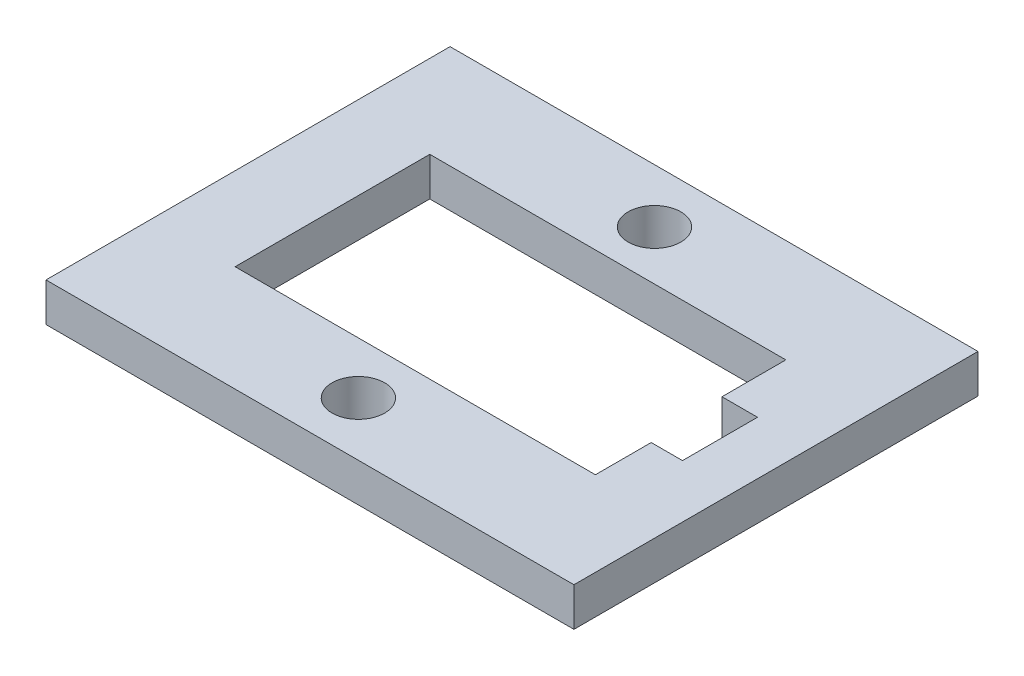
ISO-10303-21;
HEADER;
FILE_DESCRIPTION(('STEP AP214'),'2;1');
FILE_NAME('part.step','',(''),(''),'','','');
FILE_SCHEMA(('AUTOMOTIVE_DESIGN { 1 0 10303 214 1 1 1 1 }'));
ENDSEC;
DATA;
#1=APPLICATION_CONTEXT('core data for automotive mechanical design processes');
#2=APPLICATION_PROTOCOL_DEFINITION('international standard','automotive_design',2000,#1);
#3=PRODUCT_CONTEXT('',#1,'mechanical');
#4=PRODUCT('Part','Part','',(#3));
#5=PRODUCT_RELATED_PRODUCT_CATEGORY('part','',(#4));
#6=PRODUCT_DEFINITION_FORMATION('','',#4);
#7=PRODUCT_DEFINITION_CONTEXT('part definition',#1,'design');
#8=PRODUCT_DEFINITION('design','',#6,#7);
#9=PRODUCT_DEFINITION_SHAPE('','',#8);
#10=(LENGTH_UNIT() NAMED_UNIT(*) SI_UNIT(.MILLI.,.METRE.));
#11=(NAMED_UNIT(*) PLANE_ANGLE_UNIT() SI_UNIT($,.RADIAN.));
#12=(NAMED_UNIT(*) SI_UNIT($,.STERADIAN.) SOLID_ANGLE_UNIT());
#13=UNCERTAINTY_MEASURE_WITH_UNIT(LENGTH_MEASURE(1.E-05),#10,'distance_accuracy_value','');
#14=(GEOMETRIC_REPRESENTATION_CONTEXT(3) GLOBAL_UNCERTAINTY_ASSIGNED_CONTEXT((#13)) GLOBAL_UNIT_ASSIGNED_CONTEXT((#10,
#11,#12)) REPRESENTATION_CONTEXT('',''));
#15=CARTESIAN_POINT('',(0.,0.,0.));
#16=DIRECTION('',(0.,0.,1.));
#17=DIRECTION('',(1.,0.,0.));
#18=AXIS2_PLACEMENT_3D('',#15,#16,#17);
#19=CARTESIAN_POINT('',(0.,1.25,0.));
#20=DIRECTION('',(0.,1.,0.));
#21=DIRECTION('',(0.,0.,1.));
#22=AXIS2_PLACEMENT_3D('',#19,#20,#21);
#23=PLANE('',#22);
#24=CARTESIAN_POINT('',(0.,1.25,-10.5288589852008));
#25=DIRECTION('',(0.,1.,0.));
#26=DIRECTION('',(0.,0.,1.));
#27=AXIS2_PLACEMENT_3D('',#24,#25,#26);
#28=CIRCLE('',#27,1.7);
#29=CARTESIAN_POINT('',(0.,1.25,-8.82885898520084));
#30=VERTEX_POINT('',#29);
#31=EDGE_CURVE('E163',#30,#30,#28,.T.);
#32=ORIENTED_EDGE('',*,*,#31,.F.);
#33=EDGE_LOOP('',(#32));
#34=FACE_BOUND('',#33,.T.);
#35=DIRECTION('',(0.,0.,1.));
#36=VECTOR('',#35,1.);
#37=CARTESIAN_POINT('',(-16.7014916384778,1.25,-14.0165789852008));
#38=LINE('',#37,#36);
#39=CARTESIAN_POINT('',(-16.7014916384778,1.25,-14.0165789852008));
#40=VERTEX_POINT('',#39);
#41=CARTESIAN_POINT('',(-16.7014916384778,1.25,12.1011510147992));
#42=VERTEX_POINT('',#41);
#43=EDGE_CURVE('E193',#40,#42,#38,.T.);
#44=ORIENTED_EDGE('',*,*,#43,.T.);
#45=DIRECTION('',(1.,0.,0.));
#46=VECTOR('',#45,1.);
#47=CARTESIAN_POINT('',(-16.7014916384778,1.25,12.1011510147992));
#48=LINE('',#47,#46);
#49=CARTESIAN_POINT('',(17.4229383615222,1.25,12.1011510147992));
#50=VERTEX_POINT('',#49);
#51=EDGE_CURVE('E196',#42,#50,#48,.T.);
#52=ORIENTED_EDGE('',*,*,#51,.T.);
#53=DIRECTION('',(0.,0.,-1.));
#54=VECTOR('',#53,1.);
#55=CARTESIAN_POINT('',(17.4229383615222,1.25,-14.0165789852008));
#56=LINE('',#55,#54);
#57=CARTESIAN_POINT('',(17.4229383615222,1.25,-14.0165789852008));
#58=VERTEX_POINT('',#57);
#59=EDGE_CURVE('E199',#50,#58,#56,.T.);
#60=ORIENTED_EDGE('',*,*,#59,.T.);
#61=DIRECTION('',(-1.,0.,0.));
#62=VECTOR('',#61,1.);
#63=CARTESIAN_POINT('',(-16.7014916384778,1.25,-14.0165789852008));
#64=LINE('',#63,#62);
#65=EDGE_CURVE('E201',#58,#40,#64,.T.);
#66=ORIENTED_EDGE('',*,*,#65,.T.);
#67=EDGE_LOOP('',(#44,#52,#60,#66));
#68=FACE_BOUND('',#67,.T.);
#69=DIRECTION('',(1.,0.,0.));
#70=VECTOR('',#69,1.);
#71=CARTESIAN_POINT('',(11.9605883615222,1.25,5.25114101479916));
#72=LINE('',#71,#70);
#73=CARTESIAN_POINT('',(-11.3290016384778,1.25,5.25114101479916));
#74=VERTEX_POINT('',#73);
#75=CARTESIAN_POINT('',(11.9605883615222,1.25,5.25114101479916));
#76=VERTEX_POINT('',#75);
#77=EDGE_CURVE('E133',#74,#76,#72,.T.);
#78=ORIENTED_EDGE('',*,*,#77,.F.);
#79=DIRECTION('',(0.,0.,1.));
#80=VECTOR('',#79,1.);
#81=CARTESIAN_POINT('',(-11.3290016384778,1.25,5.25114101479916));
#82=LINE('',#81,#80);
#83=CARTESIAN_POINT('',(-11.3290016384778,1.25,-7.33354898520084));
#84=VERTEX_POINT('',#83);
#85=EDGE_CURVE('E125',#84,#74,#82,.T.);
#86=ORIENTED_EDGE('',*,*,#85,.F.);
#87=DIRECTION('',(-1.,0.,0.));
#88=VECTOR('',#87,1.);
#89=CARTESIAN_POINT('',(-11.3290016384778,1.25,-7.33354898520084));
#90=LINE('',#89,#88);
#91=CARTESIAN_POINT('',(11.6851488266385,1.25,-7.33354898520084));
#92=VERTEX_POINT('',#91);
#93=EDGE_CURVE('E160',#92,#84,#90,.T.);
#94=ORIENTED_EDGE('',*,*,#93,.F.);
#95=DIRECTION('',(0.,0.,-1.));
#96=VECTOR('',#95,1.);
#97=CARTESIAN_POINT('',(11.6851488266385,1.25,-7.33354898520084));
#98=LINE('',#97,#96);
#99=CARTESIAN_POINT('',(11.6851488266385,1.25,-3.20588260042284));
#100=VERTEX_POINT('',#99);
#101=EDGE_CURVE('E158',#100,#92,#98,.T.);
#102=ORIENTED_EDGE('',*,*,#101,.F.);
#103=DIRECTION('',(-1.,0.,0.));
#104=VECTOR('',#103,1.);
#105=CARTESIAN_POINT('',(11.6851488266385,1.25,-3.20588260042284));
#106=LINE('',#105,#104);
#107=CARTESIAN_POINT('',(13.9825383615222,1.25,-3.20588260042284));
#108=VERTEX_POINT('',#107);
#109=EDGE_CURVE('E156',#108,#100,#106,.T.);
#110=ORIENTED_EDGE('',*,*,#109,.F.);
#111=DIRECTION('',(0.,0.,-1.));
#112=VECTOR('',#111,1.);
#113=CARTESIAN_POINT('',(13.9825383615222,1.25,-3.20588260042284));
#114=LINE('',#113,#112);
#115=CARTESIAN_POINT('',(13.9825383615222,1.25,1.64390739957716));
#116=VERTEX_POINT('',#115);
#117=EDGE_CURVE('E154',#116,#108,#114,.T.);
#118=ORIENTED_EDGE('',*,*,#117,.F.);
#119=DIRECTION('',(1.,0.,0.));
#120=VECTOR('',#119,1.);
#121=CARTESIAN_POINT('',(13.9825383615222,1.25,1.64390739957716));
#122=LINE('',#121,#120);
#123=CARTESIAN_POINT('',(11.9605883615222,1.25,1.64390739957716));
#124=VERTEX_POINT('',#123);
#125=EDGE_CURVE('E149',#124,#116,#122,.T.);
#126=ORIENTED_EDGE('',*,*,#125,.F.);
#127=DIRECTION('',(0.,0.,-1.));
#128=VECTOR('',#127,1.);
#129=CARTESIAN_POINT('',(11.9605883615222,1.25,1.64390739957716));
#130=LINE('',#129,#128);
#131=EDGE_CURVE('E147',#76,#124,#130,.T.);
#132=ORIENTED_EDGE('',*,*,#131,.F.);
#133=EDGE_LOOP('',(#78,#86,#94,#102,#110,#118,#126,#132));
#134=FACE_BOUND('',#133,.T.);
#135=CARTESIAN_POINT('',(0.,1.25,8.61115101479916));
#136=DIRECTION('',(0.,1.,0.));
#137=DIRECTION('',(0.,0.,1.));
#138=AXIS2_PLACEMENT_3D('',#135,#136,#137);
#139=CIRCLE('',#138,1.7);
#140=CARTESIAN_POINT('',(0.,1.25,10.3111510147992));
#141=VERTEX_POINT('',#140);
#142=EDGE_CURVE('E299',#141,#141,#139,.T.);
#143=ORIENTED_EDGE('',*,*,#142,.F.);
#144=EDGE_LOOP('',(#143));
#145=FACE_BOUND('',#144,.T.);
#146=ADVANCED_FACE('F36',(#34,#68,#134,#145),#23,.T.);
#147=CARTESIAN_POINT('',(0.,-1.25,0.));
#148=DIRECTION('',(0.,1.,0.));
#149=DIRECTION('',(0.,0.,1.));
#150=AXIS2_PLACEMENT_3D('',#147,#148,#149);
#151=PLANE('',#150);
#152=DIRECTION('',(0.,0.,1.));
#153=VECTOR('',#152,1.);
#154=CARTESIAN_POINT('',(-16.7014916384778,-1.25,-14.0165789852008));
#155=LINE('',#154,#153);
#156=CARTESIAN_POINT('',(-16.7014916384778,-1.25,-14.0165789852008));
#157=VERTEX_POINT('',#156);
#158=CARTESIAN_POINT('',(-16.7014916384778,-1.25,12.1011510147992));
#159=VERTEX_POINT('',#158);
#160=EDGE_CURVE('E141',#157,#159,#155,.T.);
#161=ORIENTED_EDGE('',*,*,#160,.F.);
#162=DIRECTION('',(-1.,0.,0.));
#163=VECTOR('',#162,1.);
#164=CARTESIAN_POINT('',(-16.7014916384778,-1.25,-14.0165789852008));
#165=LINE('',#164,#163);
#166=CARTESIAN_POINT('',(17.4229383615222,-1.25,-14.0165789852008));
#167=VERTEX_POINT('',#166);
#168=EDGE_CURVE('E197',#167,#157,#165,.T.);
#169=ORIENTED_EDGE('',*,*,#168,.F.);
#170=DIRECTION('',(0.,0.,-1.));
#171=VECTOR('',#170,1.);
#172=CARTESIAN_POINT('',(17.4229383615222,-1.25,-14.0165789852008));
#173=LINE('',#172,#171);
#174=CARTESIAN_POINT('',(17.4229383615222,-1.25,12.1011510147992));
#175=VERTEX_POINT('',#174);
#176=EDGE_CURVE('E208',#175,#167,#173,.T.);
#177=ORIENTED_EDGE('',*,*,#176,.F.);
#178=DIRECTION('',(1.,0.,0.));
#179=VECTOR('',#178,1.);
#180=CARTESIAN_POINT('',(-16.7014916384778,-1.25,12.1011510147992));
#181=LINE('',#180,#179);
#182=EDGE_CURVE('E206',#159,#175,#181,.T.);
#183=ORIENTED_EDGE('',*,*,#182,.F.);
#184=EDGE_LOOP('',(#161,#169,#177,#183));
#185=FACE_BOUND('',#184,.T.);
#186=DIRECTION('',(0.,0.,1.));
#187=VECTOR('',#186,1.);
#188=CARTESIAN_POINT('',(-11.3290016384778,-1.25,5.25114101479916));
#189=LINE('',#188,#187);
#190=CARTESIAN_POINT('',(-11.3290016384778,-1.25,-7.33354898520084));
#191=VERTEX_POINT('',#190);
#192=CARTESIAN_POINT('',(-11.3290016384778,-1.25,5.25114101479916));
#193=VERTEX_POINT('',#192);
#194=EDGE_CURVE('E59',#191,#193,#189,.T.);
#195=ORIENTED_EDGE('',*,*,#194,.T.);
#196=DIRECTION('',(1.,0.,0.));
#197=VECTOR('',#196,1.);
#198=CARTESIAN_POINT('',(11.9605883615222,-1.25,5.25114101479916));
#199=LINE('',#198,#197);
#200=CARTESIAN_POINT('',(11.9605883615222,-1.25,5.25114101479916));
#201=VERTEX_POINT('',#200);
#202=EDGE_CURVE('E140',#193,#201,#199,.T.);
#203=ORIENTED_EDGE('',*,*,#202,.T.);
#204=DIRECTION('',(0.,0.,-1.));
#205=VECTOR('',#204,1.);
#206=CARTESIAN_POINT('',(11.9605883615222,-1.25,1.64390739957716));
#207=LINE('',#206,#205);
#208=CARTESIAN_POINT('',(11.9605883615222,-1.25,1.64390739957716));
#209=VERTEX_POINT('',#208);
#210=EDGE_CURVE('E165',#201,#209,#207,.T.);
#211=ORIENTED_EDGE('',*,*,#210,.T.);
#212=DIRECTION('',(1.,0.,0.));
#213=VECTOR('',#212,1.);
#214=CARTESIAN_POINT('',(13.9825383615222,-1.25,1.64390739957716));
#215=LINE('',#214,#213);
#216=CARTESIAN_POINT('',(13.9825383615222,-1.25,1.64390739957716));
#217=VERTEX_POINT('',#216);
#218=EDGE_CURVE('E168',#209,#217,#215,.T.);
#219=ORIENTED_EDGE('',*,*,#218,.T.);
#220=DIRECTION('',(0.,0.,-1.));
#221=VECTOR('',#220,1.);
#222=CARTESIAN_POINT('',(13.9825383615222,-1.25,-3.20588260042284));
#223=LINE('',#222,#221);
#224=CARTESIAN_POINT('',(13.9825383615222,-1.25,-3.20588260042284));
#225=VERTEX_POINT('',#224);
#226=EDGE_CURVE('E171',#217,#225,#223,.T.);
#227=ORIENTED_EDGE('',*,*,#226,.T.);
#228=DIRECTION('',(-1.,0.,0.));
#229=VECTOR('',#228,1.);
#230=CARTESIAN_POINT('',(11.6851488266385,-1.25,-3.20588260042284));
#231=LINE('',#230,#229);
#232=CARTESIAN_POINT('',(11.6851488266385,-1.25,-3.20588260042284));
#233=VERTEX_POINT('',#232);
#234=EDGE_CURVE('E174',#225,#233,#231,.T.);
#235=ORIENTED_EDGE('',*,*,#234,.T.);
#236=DIRECTION('',(0.,0.,-1.));
#237=VECTOR('',#236,1.);
#238=CARTESIAN_POINT('',(11.6851488266385,-1.25,-7.33354898520084));
#239=LINE('',#238,#237);
#240=CARTESIAN_POINT('',(11.6851488266385,-1.25,-7.33354898520084));
#241=VERTEX_POINT('',#240);
#242=EDGE_CURVE('E177',#233,#241,#239,.T.);
#243=ORIENTED_EDGE('',*,*,#242,.T.);
#244=DIRECTION('',(-1.,0.,0.));
#245=VECTOR('',#244,1.);
#246=CARTESIAN_POINT('',(-11.3290016384778,-1.25,-7.33354898520084));
#247=LINE('',#246,#245);
#248=EDGE_CURVE('E134',#241,#191,#247,.T.);
#249=ORIENTED_EDGE('',*,*,#248,.T.);
#250=EDGE_LOOP('',(#195,#203,#211,#219,#227,#235,#243,#249));
#251=FACE_BOUND('',#250,.T.);
#252=CARTESIAN_POINT('',(0.,-1.25,-10.5288589852008));
#253=DIRECTION('',(0.,1.,0.));
#254=DIRECTION('',(0.,0.,1.));
#255=AXIS2_PLACEMENT_3D('',#252,#253,#254);
#256=CIRCLE('',#255,1.7);
#257=CARTESIAN_POINT('',(0.,-1.25,-8.82885898520084));
#258=VERTEX_POINT('',#257);
#259=EDGE_CURVE('E305',#258,#258,#256,.T.);
#260=ORIENTED_EDGE('',*,*,#259,.T.);
#261=EDGE_LOOP('',(#260));
#262=FACE_BOUND('',#261,.T.);
#263=CARTESIAN_POINT('',(0.,-1.25,8.61115101479916));
#264=DIRECTION('',(0.,1.,0.));
#265=DIRECTION('',(0.,0.,1.));
#266=AXIS2_PLACEMENT_3D('',#263,#264,#265);
#267=CIRCLE('',#266,1.7);
#268=CARTESIAN_POINT('',(0.,-1.25,10.3111510147992));
#269=VERTEX_POINT('',#268);
#270=EDGE_CURVE('E302',#269,#269,#267,.T.);
#271=ORIENTED_EDGE('',*,*,#270,.T.);
#272=EDGE_LOOP('',(#271));
#273=FACE_BOUND('',#272,.T.);
#274=ADVANCED_FACE('F226',(#185,#251,#262,#273),#151,.F.);
#275=CARTESIAN_POINT('',(-16.7014916384778,1.25,-14.0165789852008));
#276=DIRECTION('',(1.,0.,0.));
#277=DIRECTION('',(0.,0.,-1.));
#278=AXIS2_PLACEMENT_3D('',#275,#276,#277);
#279=PLANE('',#278);
#280=ORIENTED_EDGE('',*,*,#160,.T.);
#281=DIRECTION('',(0.,-1.,0.));
#282=VECTOR('',#281,1.);
#283=CARTESIAN_POINT('',(-16.7014916384778,1.25,12.1011510147992));
#284=LINE('',#283,#282);
#285=EDGE_CURVE('E11',#42,#159,#284,.T.);
#286=ORIENTED_EDGE('',*,*,#285,.F.);
#287=ORIENTED_EDGE('',*,*,#43,.F.);
#288=DIRECTION('',(0.,-1.,0.));
#289=VECTOR('',#288,1.);
#290=CARTESIAN_POINT('',(-16.7014916384778,1.25,-14.0165789852008));
#291=LINE('',#290,#289);
#292=EDGE_CURVE('E203',#40,#157,#291,.T.);
#293=ORIENTED_EDGE('',*,*,#292,.T.);
#294=EDGE_LOOP('',(#280,#286,#287,#293));
#295=FACE_BOUND('',#294,.T.);
#296=ADVANCED_FACE('F38',(#295),#279,.F.);
#297=CARTESIAN_POINT('',(-16.7014916384778,1.25,12.1011510147992));
#298=DIRECTION('',(0.,0.,-1.));
#299=DIRECTION('',(-1.,0.,0.));
#300=AXIS2_PLACEMENT_3D('',#297,#298,#299);
#301=PLANE('',#300);
#302=ORIENTED_EDGE('',*,*,#182,.T.);
#303=DIRECTION('',(0.,-1.,0.));
#304=VECTOR('',#303,1.);
#305=CARTESIAN_POINT('',(17.4229383615222,1.25,12.1011510147992));
#306=LINE('',#305,#304);
#307=EDGE_CURVE('E44',#50,#175,#306,.T.);
#308=ORIENTED_EDGE('',*,*,#307,.F.);
#309=ORIENTED_EDGE('',*,*,#51,.F.);
#310=ORIENTED_EDGE('',*,*,#285,.T.);
#311=EDGE_LOOP('',(#302,#308,#309,#310));
#312=FACE_BOUND('',#311,.T.);
#313=ADVANCED_FACE('F236',(#312),#301,.F.);
#314=CARTESIAN_POINT('',(17.4229383615222,1.25,-14.0165789852008));
#315=DIRECTION('',(-1.,0.,0.));
#316=DIRECTION('',(0.,0.,1.));
#317=AXIS2_PLACEMENT_3D('',#314,#315,#316);
#318=PLANE('',#317);
#319=ORIENTED_EDGE('',*,*,#176,.T.);
#320=DIRECTION('',(0.,-1.,0.));
#321=VECTOR('',#320,1.);
#322=CARTESIAN_POINT('',(17.4229383615222,1.25,-14.0165789852008));
#323=LINE('',#322,#321);
#324=EDGE_CURVE('E213',#58,#167,#323,.T.);
#325=ORIENTED_EDGE('',*,*,#324,.F.);
#326=ORIENTED_EDGE('',*,*,#59,.F.);
#327=ORIENTED_EDGE('',*,*,#307,.T.);
#328=EDGE_LOOP('',(#319,#325,#326,#327));
#329=FACE_BOUND('',#328,.T.);
#330=ADVANCED_FACE('F220',(#329),#318,.F.);
#331=CARTESIAN_POINT('',(-16.7014916384778,1.25,-14.0165789852008));
#332=DIRECTION('',(0.,0.,1.));
#333=DIRECTION('',(1.,0.,0.));
#334=AXIS2_PLACEMENT_3D('',#331,#332,#333);
#335=PLANE('',#334);
#336=ORIENTED_EDGE('',*,*,#168,.T.);
#337=ORIENTED_EDGE('',*,*,#292,.F.);
#338=ORIENTED_EDGE('',*,*,#65,.F.);
#339=ORIENTED_EDGE('',*,*,#324,.T.);
#340=EDGE_LOOP('',(#336,#337,#338,#339));
#341=FACE_BOUND('',#340,.T.);
#342=ADVANCED_FACE('F230',(#341),#335,.F.);
#343=CARTESIAN_POINT('',(-11.3290016384778,1.25,5.25114101479916));
#344=DIRECTION('',(1.,0.,0.));
#345=DIRECTION('',(0.,0.,-1.));
#346=AXIS2_PLACEMENT_3D('',#343,#344,#345);
#347=PLANE('',#346);
#348=ORIENTED_EDGE('',*,*,#194,.F.);
#349=DIRECTION('',(0.,-1.,0.));
#350=VECTOR('',#349,1.);
#351=CARTESIAN_POINT('',(-11.3290016384778,1.25,-7.33354898520084));
#352=LINE('',#351,#350);
#353=EDGE_CURVE('E129',#84,#191,#352,.T.);
#354=ORIENTED_EDGE('',*,*,#353,.F.);
#355=ORIENTED_EDGE('',*,*,#85,.T.);
#356=DIRECTION('',(0.,-1.,0.));
#357=VECTOR('',#356,1.);
#358=CARTESIAN_POINT('',(-11.3290016384778,1.25,5.25114101479916));
#359=LINE('',#358,#357);
#360=EDGE_CURVE('E128',#74,#193,#359,.T.);
#361=ORIENTED_EDGE('',*,*,#360,.T.);
#362=EDGE_LOOP('',(#348,#354,#355,#361));
#363=FACE_BOUND('',#362,.T.);
#364=ADVANCED_FACE('F127',(#363),#347,.T.);
#365=CARTESIAN_POINT('',(11.9605883615222,1.25,5.25114101479916));
#366=DIRECTION('',(0.,0.,-1.));
#367=DIRECTION('',(-1.,0.,0.));
#368=AXIS2_PLACEMENT_3D('',#365,#366,#367);
#369=PLANE('',#368);
#370=ORIENTED_EDGE('',*,*,#202,.F.);
#371=ORIENTED_EDGE('',*,*,#360,.F.);
#372=ORIENTED_EDGE('',*,*,#77,.T.);
#373=DIRECTION('',(0.,-1.,0.));
#374=VECTOR('',#373,1.);
#375=CARTESIAN_POINT('',(11.9605883615222,1.25,5.25114101479916));
#376=LINE('',#375,#374);
#377=EDGE_CURVE('E142',#76,#201,#376,.T.);
#378=ORIENTED_EDGE('',*,*,#377,.T.);
#379=EDGE_LOOP('',(#370,#371,#372,#378));
#380=FACE_BOUND('',#379,.T.);
#381=ADVANCED_FACE('F137',(#380),#369,.T.);
#382=CARTESIAN_POINT('',(11.9605883615222,1.25,1.64390739957716));
#383=DIRECTION('',(-1.,0.,0.));
#384=DIRECTION('',(0.,0.,1.));
#385=AXIS2_PLACEMENT_3D('',#382,#383,#384);
#386=PLANE('',#385);
#387=ORIENTED_EDGE('',*,*,#210,.F.);
#388=ORIENTED_EDGE('',*,*,#377,.F.);
#389=ORIENTED_EDGE('',*,*,#131,.T.);
#390=DIRECTION('',(0.,-1.,0.));
#391=VECTOR('',#390,1.);
#392=CARTESIAN_POINT('',(11.9605883615222,1.25,1.64390739957716));
#393=LINE('',#392,#391);
#394=EDGE_CURVE('E190',#124,#209,#393,.T.);
#395=ORIENTED_EDGE('',*,*,#394,.T.);
#396=EDGE_LOOP('',(#387,#388,#389,#395));
#397=FACE_BOUND('',#396,.T.);
#398=ADVANCED_FACE('F261',(#397),#386,.T.);
#399=CARTESIAN_POINT('',(13.9825383615222,1.25,1.64390739957716));
#400=DIRECTION('',(0.,0.,-1.));
#401=DIRECTION('',(-1.,0.,0.));
#402=AXIS2_PLACEMENT_3D('',#399,#400,#401);
#403=PLANE('',#402);
#404=ORIENTED_EDGE('',*,*,#218,.F.);
#405=ORIENTED_EDGE('',*,*,#394,.F.);
#406=ORIENTED_EDGE('',*,*,#125,.T.);
#407=DIRECTION('',(0.,-1.,0.));
#408=VECTOR('',#407,1.);
#409=CARTESIAN_POINT('',(13.9825383615222,1.25,1.64390739957716));
#410=LINE('',#409,#408);
#411=EDGE_CURVE('E188',#116,#217,#410,.T.);
#412=ORIENTED_EDGE('',*,*,#411,.T.);
#413=EDGE_LOOP('',(#404,#405,#406,#412));
#414=FACE_BOUND('',#413,.T.);
#415=ADVANCED_FACE('F265',(#414),#403,.T.);
#416=CARTESIAN_POINT('',(13.9825383615222,1.25,-3.20588260042284));
#417=DIRECTION('',(-1.,0.,0.));
#418=DIRECTION('',(0.,0.,1.));
#419=AXIS2_PLACEMENT_3D('',#416,#417,#418);
#420=PLANE('',#419);
#421=ORIENTED_EDGE('',*,*,#226,.F.);
#422=ORIENTED_EDGE('',*,*,#411,.F.);
#423=ORIENTED_EDGE('',*,*,#117,.T.);
#424=DIRECTION('',(0.,-1.,0.));
#425=VECTOR('',#424,1.);
#426=CARTESIAN_POINT('',(13.9825383615222,1.25,-3.20588260042284));
#427=LINE('',#426,#425);
#428=EDGE_CURVE('E186',#108,#225,#427,.T.);
#429=ORIENTED_EDGE('',*,*,#428,.T.);
#430=EDGE_LOOP('',(#421,#422,#423,#429));
#431=FACE_BOUND('',#430,.T.);
#432=ADVANCED_FACE('F271',(#431),#420,.T.);
#433=CARTESIAN_POINT('',(11.6851488266385,1.25,-3.20588260042284));
#434=DIRECTION('',(0.,0.,1.));
#435=DIRECTION('',(1.,0.,0.));
#436=AXIS2_PLACEMENT_3D('',#433,#434,#435);
#437=PLANE('',#436);
#438=ORIENTED_EDGE('',*,*,#234,.F.);
#439=ORIENTED_EDGE('',*,*,#428,.F.);
#440=ORIENTED_EDGE('',*,*,#109,.T.);
#441=DIRECTION('',(0.,-1.,0.));
#442=VECTOR('',#441,1.);
#443=CARTESIAN_POINT('',(11.6851488266385,1.25,-3.20588260042284));
#444=LINE('',#443,#442);
#445=EDGE_CURVE('E184',#100,#233,#444,.T.);
#446=ORIENTED_EDGE('',*,*,#445,.T.);
#447=EDGE_LOOP('',(#438,#439,#440,#446));
#448=FACE_BOUND('',#447,.T.);
#449=ADVANCED_FACE('F275',(#448),#437,.T.);
#450=CARTESIAN_POINT('',(11.6851488266385,1.25,-7.33354898520084));
#451=DIRECTION('',(-1.,0.,0.));
#452=DIRECTION('',(0.,0.,1.));
#453=AXIS2_PLACEMENT_3D('',#450,#451,#452);
#454=PLANE('',#453);
#455=ORIENTED_EDGE('',*,*,#242,.F.);
#456=ORIENTED_EDGE('',*,*,#445,.F.);
#457=ORIENTED_EDGE('',*,*,#101,.T.);
#458=DIRECTION('',(0.,-1.,0.));
#459=VECTOR('',#458,1.);
#460=CARTESIAN_POINT('',(11.6851488266385,1.25,-7.33354898520084));
#461=LINE('',#460,#459);
#462=EDGE_CURVE('E51',#92,#241,#461,.T.);
#463=ORIENTED_EDGE('',*,*,#462,.T.);
#464=EDGE_LOOP('',(#455,#456,#457,#463));
#465=FACE_BOUND('',#464,.T.);
#466=ADVANCED_FACE('F279',(#465),#454,.T.);
#467=CARTESIAN_POINT('',(-11.3290016384778,1.25,-7.33354898520084));
#468=DIRECTION('',(0.,0.,1.));
#469=DIRECTION('',(1.,0.,0.));
#470=AXIS2_PLACEMENT_3D('',#467,#468,#469);
#471=PLANE('',#470);
#472=ORIENTED_EDGE('',*,*,#248,.F.);
#473=ORIENTED_EDGE('',*,*,#462,.F.);
#474=ORIENTED_EDGE('',*,*,#93,.T.);
#475=ORIENTED_EDGE('',*,*,#353,.T.);
#476=EDGE_LOOP('',(#472,#473,#474,#475));
#477=FACE_BOUND('',#476,.T.);
#478=ADVANCED_FACE('F283',(#477),#471,.T.);
#479=CARTESIAN_POINT('',(0.,1.25,-10.5288589852008));
#480=DIRECTION('',(0.,-1.,0.));
#481=DIRECTION('',(0.,0.,-1.));
#482=AXIS2_PLACEMENT_3D('',#479,#480,#481);
#483=CYLINDRICAL_SURFACE('',#482,1.7);
#484=ORIENTED_EDGE('',*,*,#31,.T.);
#485=EDGE_LOOP('',(#484));
#486=FACE_BOUND('',#485,.T.);
#487=ORIENTED_EDGE('',*,*,#259,.F.);
#488=EDGE_LOOP('',(#487));
#489=FACE_BOUND('',#488,.T.);
#490=ADVANCED_FACE('F287',(#486,#489),#483,.F.);
#491=CARTESIAN_POINT('',(0.,1.25,8.61115101479916));
#492=DIRECTION('',(0.,-1.,0.));
#493=DIRECTION('',(0.,0.,-1.));
#494=AXIS2_PLACEMENT_3D('',#491,#492,#493);
#495=CYLINDRICAL_SURFACE('',#494,1.7);
#496=ORIENTED_EDGE('',*,*,#142,.T.);
#497=EDGE_LOOP('',(#496));
#498=FACE_BOUND('',#497,.T.);
#499=ORIENTED_EDGE('',*,*,#270,.F.);
#500=EDGE_LOOP('',(#499));
#501=FACE_BOUND('',#500,.T.);
#502=ADVANCED_FACE('F290',(#498,#501),#495,.F.);
#503=CLOSED_SHELL('',(#146,#274,#296,#313,#330,#342,#364,#381,#398,#415,#432,#449,#466,#478,
#490,#502));
#504=MANIFOLD_SOLID_BREP('B2',#503);
#505=ADVANCED_BREP_SHAPE_REPRESENTATION('',(#18,#504),#14);
#506=SHAPE_DEFINITION_REPRESENTATION(#9,#505);
ENDSEC;
END-ISO-10303-21;
